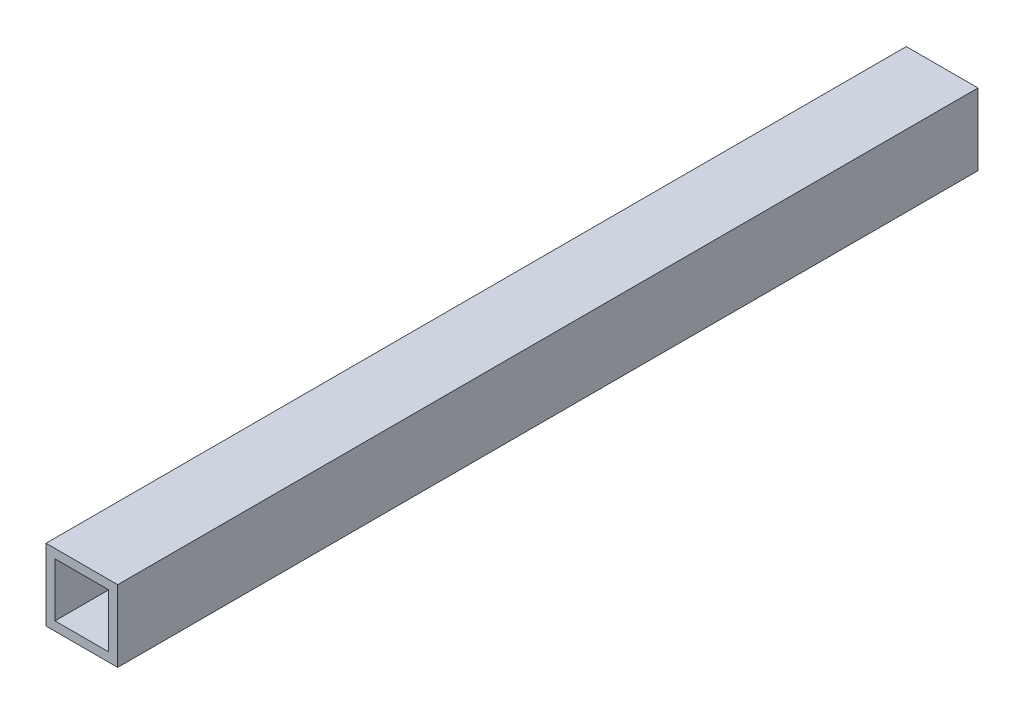
ISO-10303-21;
HEADER;
FILE_DESCRIPTION(('STEP AP214'),'2;1');
FILE_NAME('part.step','',(''),(''),'','','');
FILE_SCHEMA(('AUTOMOTIVE_DESIGN { 1 0 10303 214 1 1 1 1 }'));
ENDSEC;
DATA;
#1=APPLICATION_CONTEXT('core data for automotive mechanical design processes');
#2=APPLICATION_PROTOCOL_DEFINITION('international standard','automotive_design',2000,#1);
#3=PRODUCT_CONTEXT('',#1,'mechanical');
#4=PRODUCT('Part','Part','',(#3));
#5=PRODUCT_RELATED_PRODUCT_CATEGORY('part','',(#4));
#6=PRODUCT_DEFINITION_FORMATION('','',#4);
#7=PRODUCT_DEFINITION_CONTEXT('part definition',#1,'design');
#8=PRODUCT_DEFINITION('design','',#6,#7);
#9=PRODUCT_DEFINITION_SHAPE('','',#8);
#10=(LENGTH_UNIT() NAMED_UNIT(*) SI_UNIT(.MILLI.,.METRE.));
#11=(NAMED_UNIT(*) PLANE_ANGLE_UNIT() SI_UNIT($,.RADIAN.));
#12=(NAMED_UNIT(*) SI_UNIT($,.STERADIAN.) SOLID_ANGLE_UNIT());
#13=UNCERTAINTY_MEASURE_WITH_UNIT(LENGTH_MEASURE(1.E-05),#10,'distance_accuracy_value','');
#14=(GEOMETRIC_REPRESENTATION_CONTEXT(3) GLOBAL_UNCERTAINTY_ASSIGNED_CONTEXT((#13)) GLOBAL_UNIT_ASSIGNED_CONTEXT((#10,
#11,#12)) REPRESENTATION_CONTEXT('',''));
#15=CARTESIAN_POINT('',(0.,0.,0.));
#16=DIRECTION('',(0.,0.,1.));
#17=DIRECTION('',(1.,0.,0.));
#18=AXIS2_PLACEMENT_3D('',#15,#16,#17);
#19=CARTESIAN_POINT('',(0.,0.,304.8));
#20=DIRECTION('',(0.,0.,1.));
#21=DIRECTION('',(1.,0.,0.));
#22=AXIS2_PLACEMENT_3D('',#19,#20,#21);
#23=PLANE('',#22);
#24=DIRECTION('',(0.,-1.,0.));
#25=VECTOR('',#24,1.);
#26=CARTESIAN_POINT('',(0.,0.,304.8));
#27=LINE('',#26,#25);
#28=CARTESIAN_POINT('',(0.,0.,304.8));
#29=VERTEX_POINT('',#28);
#30=CARTESIAN_POINT('',(0.,-25.4,304.8));
#31=VERTEX_POINT('',#30);
#32=EDGE_CURVE('E134',#29,#31,#27,.T.);
#33=ORIENTED_EDGE('',*,*,#32,.T.);
#34=DIRECTION('',(1.,0.,0.));
#35=VECTOR('',#34,1.);
#36=CARTESIAN_POINT('',(0.,-25.4,304.8));
#37=LINE('',#36,#35);
#38=CARTESIAN_POINT('',(25.4,-25.4,304.8));
#39=VERTEX_POINT('',#38);
#40=EDGE_CURVE('E137',#31,#39,#37,.T.);
#41=ORIENTED_EDGE('',*,*,#40,.T.);
#42=DIRECTION('',(0.,1.,0.));
#43=VECTOR('',#42,1.);
#44=CARTESIAN_POINT('',(25.4,0.,304.8));
#45=LINE('',#44,#43);
#46=CARTESIAN_POINT('',(25.4,0.,304.8));
#47=VERTEX_POINT('',#46);
#48=EDGE_CURVE('E140',#39,#47,#45,.T.);
#49=ORIENTED_EDGE('',*,*,#48,.T.);
#50=DIRECTION('',(-1.,0.,0.));
#51=VECTOR('',#50,1.);
#52=CARTESIAN_POINT('',(0.,0.,304.8));
#53=LINE('',#52,#51);
#54=EDGE_CURVE('E142',#47,#29,#53,.T.);
#55=ORIENTED_EDGE('',*,*,#54,.T.);
#56=EDGE_LOOP('',(#33,#41,#49,#55));
#57=FACE_BOUND('',#56,.T.);
#58=DIRECTION('',(1.,0.,0.));
#59=VECTOR('',#58,1.);
#60=CARTESIAN_POINT('',(3.175,-22.225,304.8));
#61=LINE('',#60,#59);
#62=CARTESIAN_POINT('',(3.175,-22.225,304.8));
#63=VERTEX_POINT('',#62);
#64=CARTESIAN_POINT('',(22.225,-22.225,304.8));
#65=VERTEX_POINT('',#64);
#66=EDGE_CURVE('E106',#63,#65,#61,.T.);
#67=ORIENTED_EDGE('',*,*,#66,.F.);
#68=DIRECTION('',(0.,-1.,0.));
#69=VECTOR('',#68,1.);
#70=CARTESIAN_POINT('',(3.175,-3.175,304.8));
#71=LINE('',#70,#69);
#72=CARTESIAN_POINT('',(3.175,-3.175,304.8));
#73=VERTEX_POINT('',#72);
#74=EDGE_CURVE('E98',#73,#63,#71,.T.);
#75=ORIENTED_EDGE('',*,*,#74,.F.);
#76=DIRECTION('',(-1.,0.,0.));
#77=VECTOR('',#76,1.);
#78=CARTESIAN_POINT('',(3.175,-3.175,304.8));
#79=LINE('',#78,#77);
#80=CARTESIAN_POINT('',(22.225,-3.175,304.8));
#81=VERTEX_POINT('',#80);
#82=EDGE_CURVE('E120',#81,#73,#79,.T.);
#83=ORIENTED_EDGE('',*,*,#82,.F.);
#84=DIRECTION('',(0.,1.,0.));
#85=VECTOR('',#84,1.);
#86=CARTESIAN_POINT('',(22.225,-3.175,304.8));
#87=LINE('',#86,#85);
#88=EDGE_CURVE('E118',#65,#81,#87,.T.);
#89=ORIENTED_EDGE('',*,*,#88,.F.);
#90=EDGE_LOOP('',(#67,#75,#83,#89));
#91=FACE_BOUND('',#90,.T.);
#92=ADVANCED_FACE('F33',(#57,#91),#23,.T.);
#93=CARTESIAN_POINT('',(0.,0.,0.));
#94=DIRECTION('',(0.,0.,1.));
#95=DIRECTION('',(1.,0.,0.));
#96=AXIS2_PLACEMENT_3D('',#93,#94,#95);
#97=PLANE('',#96);
#98=DIRECTION('',(0.,-1.,0.));
#99=VECTOR('',#98,1.);
#100=CARTESIAN_POINT('',(0.,0.,0.));
#101=LINE('',#100,#99);
#102=CARTESIAN_POINT('',(0.,0.,0.));
#103=VERTEX_POINT('',#102);
#104=CARTESIAN_POINT('',(0.,-25.4,0.));
#105=VERTEX_POINT('',#104);
#106=EDGE_CURVE('E114',#103,#105,#101,.T.);
#107=ORIENTED_EDGE('',*,*,#106,.F.);
#108=DIRECTION('',(-1.,0.,0.));
#109=VECTOR('',#108,1.);
#110=CARTESIAN_POINT('',(0.,0.,0.));
#111=LINE('',#110,#109);
#112=CARTESIAN_POINT('',(25.4,0.,0.));
#113=VERTEX_POINT('',#112);
#114=EDGE_CURVE('E138',#113,#103,#111,.T.);
#115=ORIENTED_EDGE('',*,*,#114,.F.);
#116=DIRECTION('',(0.,1.,0.));
#117=VECTOR('',#116,1.);
#118=CARTESIAN_POINT('',(25.4,0.,0.));
#119=LINE('',#118,#117);
#120=CARTESIAN_POINT('',(25.4,-25.4,0.));
#121=VERTEX_POINT('',#120);
#122=EDGE_CURVE('E149',#121,#113,#119,.T.);
#123=ORIENTED_EDGE('',*,*,#122,.F.);
#124=DIRECTION('',(1.,0.,0.));
#125=VECTOR('',#124,1.);
#126=CARTESIAN_POINT('',(0.,-25.4,0.));
#127=LINE('',#126,#125);
#128=EDGE_CURVE('E147',#105,#121,#127,.T.);
#129=ORIENTED_EDGE('',*,*,#128,.F.);
#130=EDGE_LOOP('',(#107,#115,#123,#129));
#131=FACE_BOUND('',#130,.T.);
#132=DIRECTION('',(0.,-1.,0.));
#133=VECTOR('',#132,1.);
#134=CARTESIAN_POINT('',(3.175,-3.175,0.));
#135=LINE('',#134,#133);
#136=CARTESIAN_POINT('',(3.175,-3.175,0.));
#137=VERTEX_POINT('',#136);
#138=CARTESIAN_POINT('',(3.175,-22.225,0.));
#139=VERTEX_POINT('',#138);
#140=EDGE_CURVE('E56',#137,#139,#135,.T.);
#141=ORIENTED_EDGE('',*,*,#140,.T.);
#142=DIRECTION('',(1.,0.,0.));
#143=VECTOR('',#142,1.);
#144=CARTESIAN_POINT('',(3.175,-22.225,0.));
#145=LINE('',#144,#143);
#146=CARTESIAN_POINT('',(22.225,-22.225,0.));
#147=VERTEX_POINT('',#146);
#148=EDGE_CURVE('E113',#139,#147,#145,.T.);
#149=ORIENTED_EDGE('',*,*,#148,.T.);
#150=DIRECTION('',(0.,1.,0.));
#151=VECTOR('',#150,1.);
#152=CARTESIAN_POINT('',(22.225,-3.175,0.));
#153=LINE('',#152,#151);
#154=CARTESIAN_POINT('',(22.225,-3.175,0.));
#155=VERTEX_POINT('',#154);
#156=EDGE_CURVE('E126',#147,#155,#153,.T.);
#157=ORIENTED_EDGE('',*,*,#156,.T.);
#158=DIRECTION('',(-1.,0.,0.));
#159=VECTOR('',#158,1.);
#160=CARTESIAN_POINT('',(3.175,-3.175,0.));
#161=LINE('',#160,#159);
#162=EDGE_CURVE('E107',#155,#137,#161,.T.);
#163=ORIENTED_EDGE('',*,*,#162,.T.);
#164=EDGE_LOOP('',(#141,#149,#157,#163));
#165=FACE_BOUND('',#164,.T.);
#166=ADVANCED_FACE('F167',(#131,#165),#97,.F.);
#167=CARTESIAN_POINT('',(0.,0.,304.8));
#168=DIRECTION('',(1.,0.,0.));
#169=DIRECTION('',(0.,1.,0.));
#170=AXIS2_PLACEMENT_3D('',#167,#168,#169);
#171=PLANE('',#170);
#172=ORIENTED_EDGE('',*,*,#106,.T.);
#173=DIRECTION('',(0.,0.,-1.));
#174=VECTOR('',#173,1.);
#175=CARTESIAN_POINT('',(0.,-25.4,304.8));
#176=LINE('',#175,#174);
#177=EDGE_CURVE('E11',#31,#105,#176,.T.);
#178=ORIENTED_EDGE('',*,*,#177,.F.);
#179=ORIENTED_EDGE('',*,*,#32,.F.);
#180=DIRECTION('',(0.,0.,-1.));
#181=VECTOR('',#180,1.);
#182=CARTESIAN_POINT('',(0.,0.,304.8));
#183=LINE('',#182,#181);
#184=EDGE_CURVE('E144',#29,#103,#183,.T.);
#185=ORIENTED_EDGE('',*,*,#184,.T.);
#186=EDGE_LOOP('',(#172,#178,#179,#185));
#187=FACE_BOUND('',#186,.T.);
#188=ADVANCED_FACE('F35',(#187),#171,.F.);
#189=CARTESIAN_POINT('',(0.,-25.4,304.8));
#190=DIRECTION('',(0.,1.,0.));
#191=DIRECTION('',(0.,0.,1.));
#192=AXIS2_PLACEMENT_3D('',#189,#190,#191);
#193=PLANE('',#192);
#194=ORIENTED_EDGE('',*,*,#128,.T.);
#195=DIRECTION('',(0.,0.,-1.));
#196=VECTOR('',#195,1.);
#197=CARTESIAN_POINT('',(25.4,-25.4,304.8));
#198=LINE('',#197,#196);
#199=EDGE_CURVE('E41',#39,#121,#198,.T.);
#200=ORIENTED_EDGE('',*,*,#199,.F.);
#201=ORIENTED_EDGE('',*,*,#40,.F.);
#202=ORIENTED_EDGE('',*,*,#177,.T.);
#203=EDGE_LOOP('',(#194,#200,#201,#202));
#204=FACE_BOUND('',#203,.T.);
#205=ADVANCED_FACE('F177',(#204),#193,.F.);
#206=CARTESIAN_POINT('',(25.4,0.,304.8));
#207=DIRECTION('',(-1.,0.,0.));
#208=DIRECTION('',(0.,-1.,0.));
#209=AXIS2_PLACEMENT_3D('',#206,#207,#208);
#210=PLANE('',#209);
#211=ORIENTED_EDGE('',*,*,#122,.T.);
#212=DIRECTION('',(0.,0.,-1.));
#213=VECTOR('',#212,1.);
#214=CARTESIAN_POINT('',(25.4,0.,304.8));
#215=LINE('',#214,#213);
#216=EDGE_CURVE('E154',#47,#113,#215,.T.);
#217=ORIENTED_EDGE('',*,*,#216,.F.);
#218=ORIENTED_EDGE('',*,*,#48,.F.);
#219=ORIENTED_EDGE('',*,*,#199,.T.);
#220=EDGE_LOOP('',(#211,#217,#218,#219));
#221=FACE_BOUND('',#220,.T.);
#222=ADVANCED_FACE('F161',(#221),#210,.F.);
#223=CARTESIAN_POINT('',(0.,0.,304.8));
#224=DIRECTION('',(0.,-1.,0.));
#225=DIRECTION('',(0.,0.,-1.));
#226=AXIS2_PLACEMENT_3D('',#223,#224,#225);
#227=PLANE('',#226);
#228=ORIENTED_EDGE('',*,*,#114,.T.);
#229=ORIENTED_EDGE('',*,*,#184,.F.);
#230=ORIENTED_EDGE('',*,*,#54,.F.);
#231=ORIENTED_EDGE('',*,*,#216,.T.);
#232=EDGE_LOOP('',(#228,#229,#230,#231));
#233=FACE_BOUND('',#232,.T.);
#234=ADVANCED_FACE('F171',(#233),#227,.F.);
#235=CARTESIAN_POINT('',(3.175,-3.175,304.8));
#236=DIRECTION('',(1.,0.,0.));
#237=DIRECTION('',(0.,1.,0.));
#238=AXIS2_PLACEMENT_3D('',#235,#236,#237);
#239=PLANE('',#238);
#240=ORIENTED_EDGE('',*,*,#140,.F.);
#241=DIRECTION('',(0.,0.,-1.));
#242=VECTOR('',#241,1.);
#243=CARTESIAN_POINT('',(3.175,-3.175,304.8));
#244=LINE('',#243,#242);
#245=EDGE_CURVE('E102',#73,#137,#244,.T.);
#246=ORIENTED_EDGE('',*,*,#245,.F.);
#247=ORIENTED_EDGE('',*,*,#74,.T.);
#248=DIRECTION('',(0.,0.,-1.));
#249=VECTOR('',#248,1.);
#250=CARTESIAN_POINT('',(3.175,-22.225,304.8));
#251=LINE('',#250,#249);
#252=EDGE_CURVE('E101',#63,#139,#251,.T.);
#253=ORIENTED_EDGE('',*,*,#252,.T.);
#254=EDGE_LOOP('',(#240,#246,#247,#253));
#255=FACE_BOUND('',#254,.T.);
#256=ADVANCED_FACE('F100',(#255),#239,.T.);
#257=CARTESIAN_POINT('',(3.175,-22.225,304.8));
#258=DIRECTION('',(0.,1.,0.));
#259=DIRECTION('',(0.,0.,1.));
#260=AXIS2_PLACEMENT_3D('',#257,#258,#259);
#261=PLANE('',#260);
#262=ORIENTED_EDGE('',*,*,#148,.F.);
#263=ORIENTED_EDGE('',*,*,#252,.F.);
#264=ORIENTED_EDGE('',*,*,#66,.T.);
#265=DIRECTION('',(0.,0.,-1.));
#266=VECTOR('',#265,1.);
#267=CARTESIAN_POINT('',(22.225,-22.225,304.8));
#268=LINE('',#267,#266);
#269=EDGE_CURVE('E115',#65,#147,#268,.T.);
#270=ORIENTED_EDGE('',*,*,#269,.T.);
#271=EDGE_LOOP('',(#262,#263,#264,#270));
#272=FACE_BOUND('',#271,.T.);
#273=ADVANCED_FACE('F110',(#272),#261,.T.);
#274=CARTESIAN_POINT('',(22.225,-3.175,304.8));
#275=DIRECTION('',(-1.,0.,0.));
#276=DIRECTION('',(0.,0.,1.));
#277=AXIS2_PLACEMENT_3D('',#274,#275,#276);
#278=PLANE('',#277);
#279=ORIENTED_EDGE('',*,*,#156,.F.);
#280=ORIENTED_EDGE('',*,*,#269,.F.);
#281=ORIENTED_EDGE('',*,*,#88,.T.);
#282=DIRECTION('',(0.,0.,-1.));
#283=VECTOR('',#282,1.);
#284=CARTESIAN_POINT('',(22.225,-3.175,304.8));
#285=LINE('',#284,#283);
#286=EDGE_CURVE('E48',#81,#155,#285,.T.);
#287=ORIENTED_EDGE('',*,*,#286,.T.);
#288=EDGE_LOOP('',(#279,#280,#281,#287));
#289=FACE_BOUND('',#288,.T.);
#290=ADVANCED_FACE('F200',(#289),#278,.T.);
#291=CARTESIAN_POINT('',(3.175,-3.175,304.8));
#292=DIRECTION('',(0.,-1.,0.));
#293=DIRECTION('',(0.,0.,-1.));
#294=AXIS2_PLACEMENT_3D('',#291,#292,#293);
#295=PLANE('',#294);
#296=ORIENTED_EDGE('',*,*,#162,.F.);
#297=ORIENTED_EDGE('',*,*,#286,.F.);
#298=ORIENTED_EDGE('',*,*,#82,.T.);
#299=ORIENTED_EDGE('',*,*,#245,.T.);
#300=EDGE_LOOP('',(#296,#297,#298,#299));
#301=FACE_BOUND('',#300,.T.);
#302=ADVANCED_FACE('F204',(#301),#295,.T.);
#303=CLOSED_SHELL('',(#92,#166,#188,#205,#222,#234,#256,#273,#290,#302));
#304=MANIFOLD_SOLID_BREP('B2',#303);
#305=ADVANCED_BREP_SHAPE_REPRESENTATION('',(#18,#304),#14);
#306=SHAPE_DEFINITION_REPRESENTATION(#9,#305);
ENDSEC;
END-ISO-10303-21;
